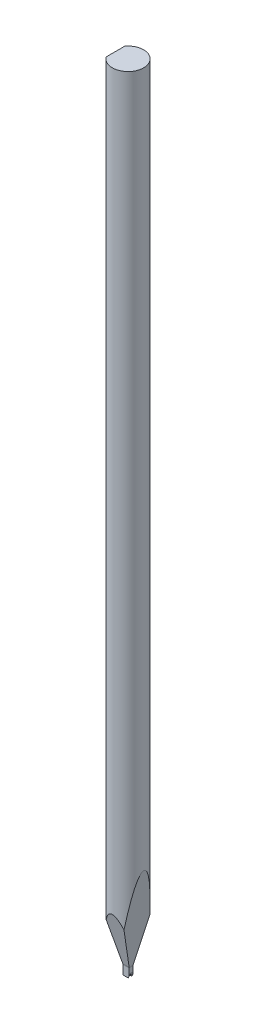
ISO-10303-21;
HEADER;
FILE_DESCRIPTION(('STEP AP214'),'2;1');
FILE_NAME('part.step','',(''),(''),'','','');
FILE_SCHEMA(('AUTOMOTIVE_DESIGN { 1 0 10303 214 1 1 1 1 }'));
ENDSEC;
DATA;
#1=APPLICATION_CONTEXT('core data for automotive mechanical design processes');
#2=APPLICATION_PROTOCOL_DEFINITION('international standard','automotive_design',2000,#1);
#3=PRODUCT_CONTEXT('',#1,'mechanical');
#4=PRODUCT('Part','Part','',(#3));
#5=PRODUCT_RELATED_PRODUCT_CATEGORY('part','',(#4));
#6=PRODUCT_DEFINITION_FORMATION('','',#4);
#7=PRODUCT_DEFINITION_CONTEXT('part definition',#1,'design');
#8=PRODUCT_DEFINITION('design','',#6,#7);
#9=PRODUCT_DEFINITION_SHAPE('','',#8);
#10=(LENGTH_UNIT() NAMED_UNIT(*) SI_UNIT(.MILLI.,.METRE.));
#11=(NAMED_UNIT(*) PLANE_ANGLE_UNIT() SI_UNIT($,.RADIAN.));
#12=(NAMED_UNIT(*) SI_UNIT($,.STERADIAN.) SOLID_ANGLE_UNIT());
#13=UNCERTAINTY_MEASURE_WITH_UNIT(LENGTH_MEASURE(1.E-05),#10,'distance_accuracy_value','');
#14=(GEOMETRIC_REPRESENTATION_CONTEXT(3) GLOBAL_UNCERTAINTY_ASSIGNED_CONTEXT((#13)) GLOBAL_UNIT_ASSIGNED_CONTEXT((#10,
#11,#12)) REPRESENTATION_CONTEXT('',''));
#15=CARTESIAN_POINT('',(0.,0.,0.));
#16=DIRECTION('',(0.,0.,1.));
#17=DIRECTION('',(1.,0.,0.));
#18=AXIS2_PLACEMENT_3D('',#15,#16,#17);
#19=CARTESIAN_POINT('',(0.,0.,0.));
#20=DIRECTION('',(0.,1.,0.));
#21=DIRECTION('',(0.,0.,1.));
#22=AXIS2_PLACEMENT_3D('',#19,#20,#21);
#23=PLANE('',#22);
#24=DIRECTION('',(-1.,0.,0.));
#25=VECTOR('',#24,1.);
#26=CARTESIAN_POINT('',(1.50859998,0.,-0.18161));
#27=LINE('',#26,#25);
#28=CARTESIAN_POINT('',(0.208640592430683,0.,-0.18161));
#29=VERTEX_POINT('',#28);
#30=CARTESIAN_POINT('',(-0.30226,0.,-0.18161));
#31=VERTEX_POINT('',#30);
#32=EDGE_CURVE('E335',#29,#31,#27,.T.);
#33=ORIENTED_EDGE('',*,*,#32,.F.);
#34=CARTESIAN_POINT('',(0.04826,0.,-0.414004033129109));
#35=DIRECTION('',(0.,1.,0.));
#36=DIRECTION('',(0.,0.,-1.));
#37=AXIS2_PLACEMENT_3D('',#34,#35,#36);
#38=ELLIPSE('',#37,0.303875210634501,0.24892);
#39=CARTESIAN_POINT('',(0.0482615048289154,0.,-0.110128822494608));
#40=VERTEX_POINT('',#39);
#41=EDGE_CURVE('E337',#29,#40,#38,.F.);
#42=ORIENTED_EDGE('',*,*,#41,.T.);
#43=CARTESIAN_POINT('',(0.0482615048289155,0.,-0.110128822494608));
#44=DIRECTION('',(-1.,0.,0.));
#45=VECTOR('',#44,1.);
#46=LINE('',#43,#45);
#47=CARTESIAN_POINT('',(-0.25146,0.,-0.110128822494608));
#48=VERTEX_POINT('',#47);
#49=EDGE_CURVE('E387',#40,#48,#46,.T.);
#50=ORIENTED_EDGE('',*,*,#49,.T.);
#51=CARTESIAN_POINT('',(-0.25146,0.,-0.17214417160369));
#52=DIRECTION('',(0.,1.,0.));
#53=DIRECTION('',(0.,0.,1.));
#54=AXIS2_PLACEMENT_3D('',#51,#52,#53);
#55=ELLIPSE('',#54,0.0620153491090818,0.0508);
#56=CARTESIAN_POINT('',(-0.30226,0.,-0.17214417160369));
#57=VERTEX_POINT('',#56);
#58=EDGE_CURVE('E476',#48,#57,#55,.F.);
#59=ORIENTED_EDGE('',*,*,#58,.T.);
#60=DIRECTION('',(0.,0.,-1.));
#61=VECTOR('',#60,1.);
#62=CARTESIAN_POINT('',(-0.30226,0.,0.18161));
#63=LINE('',#62,#61);
#64=EDGE_CURVE('E207',#57,#31,#63,.T.);
#65=ORIENTED_EDGE('',*,*,#64,.T.);
#66=EDGE_LOOP('',(#33,#42,#50,#59,#65));
#67=FACE_BOUND('',#66,.T.);
#68=ADVANCED_FACE('F41',(#67),#23,.F.);
#69=CARTESIAN_POINT('',(0.,75.9968,0.));
#70=DIRECTION('',(0.,-1.,0.));
#71=DIRECTION('',(0.,0.,-1.));
#72=AXIS2_PLACEMENT_3D('',#69,#70,#71);
#73=CYLINDRICAL_SURFACE('',#72,1.4986);
#74=CARTESIAN_POINT('',(0.,-1.25153165228785,0.));
#75=DIRECTION('',(-0.99026806874157,-0.139173100960066,0.));
#76=DIRECTION('',(0.139173100960066,-0.99026806874157,0.));
#77=AXIS2_PLACEMENT_3D('',#74,#75,#76);
#78=ELLIPSE('',#77,10.7678853863435,1.4986);
#79=CARTESIAN_POINT('',(-0.853200931790867,4.81930842488687,1.23201060465858));
#80=VERTEX_POINT('',#79);
#81=CARTESIAN_POINT('',(-1.20142,7.29701583957897,0.89576333012688));
#82=VERTEX_POINT('',#81);
#83=EDGE_CURVE('E428',#80,#82,#78,.T.);
#84=ORIENTED_EDGE('',*,*,#83,.F.);
#85=CARTESIAN_POINT('',(0.,0.221382252837424,0.));
#86=DIRECTION('',(0.,-0.258819045102522,0.965925826289068));
#87=DIRECTION('',(0.,-0.965925826289068,-0.258819045102522));
#88=AXIS2_PLACEMENT_3D('',#85,#86,#87);
#89=ELLIPSE('',#88,5.79014577310717,1.4986);
#90=CARTESIAN_POINT('',(0.849471292927085,4.82891674363001,1.23458514590642));
#91=VERTEX_POINT('',#90);
#92=EDGE_CURVE('E451',#91,#80,#89,.T.);
#93=ORIENTED_EDGE('',*,*,#92,.F.);
#94=CARTESIAN_POINT('',(0.,-1.21538557409825,0.));
#95=DIRECTION('',(0.990268068741571,-0.139173100960058,0.));
#96=DIRECTION('',(-0.139173100960058,-0.990268068741571,0.));
#97=AXIS2_PLACEMENT_3D('',#94,#95,#96);
#98=ELLIPSE('',#97,10.7678853863441,1.4986);
#99=CARTESIAN_POINT('',(0.849471292927085,4.82891674363001,-1.23458514590642));
#100=VERTEX_POINT('',#99);
#101=EDGE_CURVE('E441',#100,#91,#98,.T.);
#102=ORIENTED_EDGE('',*,*,#101,.F.);
#103=CARTESIAN_POINT('',(0.,0.221382252837424,0.));
#104=DIRECTION('',(0.,-0.258819045102522,-0.965925826289068));
#105=DIRECTION('',(0.,-0.965925826289068,0.258819045102522));
#106=AXIS2_PLACEMENT_3D('',#103,#104,#105);
#107=ELLIPSE('',#106,5.79014577310717,1.4986);
#108=CARTESIAN_POINT('',(-0.853200931790867,4.81930842488687,-1.23201060465858));
#109=VERTEX_POINT('',#108);
#110=EDGE_CURVE('E227',#109,#100,#107,.T.);
#111=ORIENTED_EDGE('',*,*,#110,.F.);
#112=CARTESIAN_POINT('',(-1.20142,7.29701583957897,-0.89576333012688));
#113=VERTEX_POINT('',#112);
#114=EDGE_CURVE('E435',#113,#109,#78,.T.);
#115=ORIENTED_EDGE('',*,*,#114,.F.);
#116=DIRECTION('',(0.,-1.,0.));
#117=VECTOR('',#116,1.);
#118=CARTESIAN_POINT('',(-1.20142,75.9968,-0.89576333012688));
#119=LINE('',#118,#117);
#120=CARTESIAN_POINT('',(-1.20142,75.9968,-0.89576333012688));
#121=VERTEX_POINT('',#120);
#122=EDGE_CURVE('E440',#121,#113,#119,.T.);
#123=ORIENTED_EDGE('',*,*,#122,.F.);
#124=CARTESIAN_POINT('',(0.,75.9968,0.));
#125=DIRECTION('',(0.,1.,0.));
#126=DIRECTION('',(0.,0.,1.));
#127=AXIS2_PLACEMENT_3D('',#124,#125,#126);
#128=CIRCLE('',#127,1.4986);
#129=CARTESIAN_POINT('',(-1.20142,75.9968,0.89576333012688));
#130=VERTEX_POINT('',#129);
#131=EDGE_CURVE('E442',#130,#121,#128,.T.);
#132=ORIENTED_EDGE('',*,*,#131,.F.);
#133=DIRECTION('',(0.,-1.,0.));
#134=VECTOR('',#133,1.);
#135=CARTESIAN_POINT('',(-1.20142,75.9968,0.89576333012688));
#136=LINE('',#135,#134);
#137=EDGE_CURVE('E437',#82,#130,#136,.F.);
#138=ORIENTED_EDGE('',*,*,#137,.F.);
#139=EDGE_LOOP('',(#84,#93,#102,#111,#115,#123,#132,#138));
#140=FACE_BOUND('',#139,.T.);
#141=ADVANCED_FACE('F251',(#140),#73,.T.);
#142=CARTESIAN_POINT('',(-1.20142,75.9968,1.50859998));
#143=DIRECTION('',(-1.,0.,0.));
#144=DIRECTION('',(0.,0.,1.));
#145=AXIS2_PLACEMENT_3D('',#142,#143,#144);
#146=PLANE('',#145);
#147=ORIENTED_EDGE('',*,*,#122,.T.);
#148=DIRECTION('',(0.,0.,1.));
#149=VECTOR('',#148,1.);
#150=CARTESIAN_POINT('',(-1.20142,7.29701583957897,1.50859998));
#151=LINE('',#150,#149);
#152=EDGE_CURVE('E430',#113,#82,#151,.T.);
#153=ORIENTED_EDGE('',*,*,#152,.T.);
#154=ORIENTED_EDGE('',*,*,#137,.T.);
#155=DIRECTION('',(0.,0.,-1.));
#156=VECTOR('',#155,1.);
#157=CARTESIAN_POINT('',(-1.20142,75.9968,1.50859998));
#158=LINE('',#157,#156);
#159=EDGE_CURVE('E434',#130,#121,#158,.T.);
#160=ORIENTED_EDGE('',*,*,#159,.T.);
#161=EDGE_LOOP('',(#147,#153,#154,#160));
#162=FACE_BOUND('',#161,.T.);
#163=ADVANCED_FACE('F255',(#162),#146,.T.);
#164=CARTESIAN_POINT('',(0.,75.9968,0.));
#165=DIRECTION('',(0.,1.,0.));
#166=DIRECTION('',(0.,0.,1.));
#167=AXIS2_PLACEMENT_3D('',#164,#165,#166);
#168=PLANE('',#167);
#169=ORIENTED_EDGE('',*,*,#131,.T.);
#170=ORIENTED_EDGE('',*,*,#159,.F.);
#171=EDGE_LOOP('',(#169,#170));
#172=FACE_BOUND('',#171,.T.);
#173=ADVANCED_FACE('F249',(#172),#168,.T.);
#174=CARTESIAN_POINT('',(1.50859998,0.931460303068842,-0.190264840122577));
#175=DIRECTION('',(0.,-0.258819045102522,-0.965925826289068));
#176=DIRECTION('',(0.,0.965925826289068,-0.258819045102522));
#177=AXIS2_PLACEMENT_3D('',#174,#175,#176);
#178=PLANE('',#177);
#179=ORIENTED_EDGE('',*,*,#110,.T.);
#180=DIRECTION('',(-0.13451818867903,-0.957146646836786,0.256466671058075));
#181=VECTOR('',#180,1.);
#182=CARTESIAN_POINT('',(0.323558186318037,1.08685054825878,-0.231901530832895));
#183=LINE('',#182,#181);
#184=CARTESIAN_POINT('',(0.301719511554435,0.931460303068842,-0.190264840122577));
#185=VERTEX_POINT('',#184);
#186=EDGE_CURVE('E497',#100,#185,#183,.T.);
#187=ORIENTED_EDGE('',*,*,#186,.T.);
#188=DIRECTION('',(-1.,0.,0.));
#189=VECTOR('',#188,1.);
#190=CARTESIAN_POINT('',(1.50859998,0.931460303068842,-0.190264840122577));
#191=LINE('',#190,#189);
#192=CARTESIAN_POINT('',(-0.306799511554435,0.931460303068842,-0.190264840122577));
#193=VERTEX_POINT('',#192);
#194=EDGE_CURVE('E202',#185,#193,#191,.T.);
#195=ORIENTED_EDGE('',*,*,#194,.T.);
#196=DIRECTION('',(-0.134518188679037,0.957146646836785,-0.256466671058074));
#197=VECTOR('',#196,1.);
#198=CARTESIAN_POINT('',(-0.273949597997433,0.697721022762415,-0.127634588725038));
#199=LINE('',#198,#197);
#200=EDGE_CURVE('E213',#193,#109,#199,.T.);
#201=ORIENTED_EDGE('',*,*,#200,.T.);
#202=EDGE_LOOP('',(#179,#187,#195,#201));
#203=FACE_BOUND('',#202,.T.);
#204=ADVANCED_FACE('F311',(#203),#178,.T.);
#205=CARTESIAN_POINT('',(1.50859998,0.931460303068842,0.190264840122577));
#206=DIRECTION('',(0.,-0.258819045102522,0.965925826289068));
#207=DIRECTION('',(0.,-0.965925826289068,-0.258819045102522));
#208=AXIS2_PLACEMENT_3D('',#205,#206,#207);
#209=PLANE('',#208);
#210=ORIENTED_EDGE('',*,*,#92,.T.);
#211=DIRECTION('',(0.134518188679037,-0.957146646836785,-0.256466671058074));
#212=VECTOR('',#211,1.);
#213=CARTESIAN_POINT('',(-0.273949597997433,0.697721022762415,0.127634588725038));
#214=LINE('',#213,#212);
#215=CARTESIAN_POINT('',(-0.306799511554435,0.931460303068842,0.190264840122577));
#216=VERTEX_POINT('',#215);
#217=EDGE_CURVE('E201',#80,#216,#214,.T.);
#218=ORIENTED_EDGE('',*,*,#217,.T.);
#219=DIRECTION('',(-1.,0.,0.));
#220=VECTOR('',#219,1.);
#221=CARTESIAN_POINT('',(1.50859998,0.931460303068842,0.190264840122577));
#222=LINE('',#221,#220);
#223=CARTESIAN_POINT('',(0.301719511554435,0.931460303068842,0.190264840122577));
#224=VERTEX_POINT('',#223);
#225=EDGE_CURVE('E188',#224,#216,#222,.T.);
#226=ORIENTED_EDGE('',*,*,#225,.F.);
#227=DIRECTION('',(0.13451818867903,0.957146646836786,0.256466671058075));
#228=VECTOR('',#227,1.);
#229=CARTESIAN_POINT('',(0.323558186318037,1.08685054825878,0.231901530832895));
#230=LINE('',#229,#228);
#231=EDGE_CURVE('E487',#224,#91,#230,.T.);
#232=ORIENTED_EDGE('',*,*,#231,.T.);
#233=EDGE_LOOP('',(#210,#218,#226,#232));
#234=FACE_BOUND('',#233,.T.);
#235=ADVANCED_FACE('F308',(#234),#209,.T.);
#236=CARTESIAN_POINT('',(0.29718,0.89916,1.50859998));
#237=DIRECTION('',(0.990268068741571,-0.139173100960058,0.));
#238=DIRECTION('',(0.139173100960058,0.990268068741571,0.));
#239=AXIS2_PLACEMENT_3D('',#236,#237,#238);
#240=PLANE('',#239);
#241=ORIENTED_EDGE('',*,*,#101,.T.);
#242=ORIENTED_EDGE('',*,*,#231,.F.);
#243=CARTESIAN_POINT('',(0.292480351816997,0.865720265612802,0.43561));
#244=DIRECTION('',(0.990268068741571,-0.139173100960058,0.));
#245=DIRECTION('',(-0.139173100960058,-0.990268068741571,0.));
#246=AXIS2_PLACEMENT_3D('',#243,#244,#245);
#247=ELLIPSE('',#246,0.256496203419729,0.254);
#248=CARTESIAN_POINT('',(0.29718,0.89916,0.183820833902422));
#249=VERTEX_POINT('',#248);
#250=EDGE_CURVE('E499',#249,#224,#247,.T.);
#251=ORIENTED_EDGE('',*,*,#250,.F.);
#252=DIRECTION('',(0.,0.,-1.));
#253=VECTOR('',#252,1.);
#254=CARTESIAN_POINT('',(0.29718,0.89916,1.50859998));
#255=LINE('',#254,#253);
#256=CARTESIAN_POINT('',(0.29718,0.89916,-0.183820833902422));
#257=VERTEX_POINT('',#256);
#258=EDGE_CURVE('E401',#249,#257,#255,.T.);
#259=ORIENTED_EDGE('',*,*,#258,.T.);
#260=CARTESIAN_POINT('',(0.292480351816997,0.865720265612802,-0.43561));
#261=DIRECTION('',(0.990268068741571,-0.139173100960058,0.));
#262=DIRECTION('',(-0.139173100960058,-0.990268068741571,0.));
#263=AXIS2_PLACEMENT_3D('',#260,#261,#262);
#264=ELLIPSE('',#263,0.256496203419729,0.254);
#265=EDGE_CURVE('E503',#185,#257,#264,.T.);
#266=ORIENTED_EDGE('',*,*,#265,.F.);
#267=ORIENTED_EDGE('',*,*,#186,.F.);
#268=EDGE_LOOP('',(#241,#242,#251,#259,#266,#267));
#269=FACE_BOUND('',#268,.T.);
#270=ADVANCED_FACE('F310',(#269),#240,.T.);
#271=CARTESIAN_POINT('',(-0.30226,0.89916,1.50859998));
#272=DIRECTION('',(-0.99026806874157,-0.139173100960066,0.));
#273=DIRECTION('',(0.139173100960066,-0.99026806874157,0.));
#274=AXIS2_PLACEMENT_3D('',#271,#272,#273);
#275=PLANE('',#274);
#276=ORIENTED_EDGE('',*,*,#83,.T.);
#277=ORIENTED_EDGE('',*,*,#152,.F.);
#278=ORIENTED_EDGE('',*,*,#114,.T.);
#279=ORIENTED_EDGE('',*,*,#200,.F.);
#280=CARTESIAN_POINT('',(-0.297560351816997,0.865720265612802,-0.43561));
#281=DIRECTION('',(-0.99026806874157,-0.139173100960066,0.));
#282=DIRECTION('',(-0.139173100960066,0.99026806874157,0.));
#283=AXIS2_PLACEMENT_3D('',#280,#281,#282);
#284=ELLIPSE('',#283,0.256496203419729,0.254);
#285=CARTESIAN_POINT('',(-0.30226,0.89916,-0.183820833902422));
#286=VERTEX_POINT('',#285);
#287=EDGE_CURVE('E208',#286,#193,#284,.T.);
#288=ORIENTED_EDGE('',*,*,#287,.F.);
#289=DIRECTION('',(0.,0.,-1.));
#290=VECTOR('',#289,1.);
#291=CARTESIAN_POINT('',(-0.30226,0.89916,1.50859998));
#292=LINE('',#291,#290);
#293=CARTESIAN_POINT('',(-0.30226,0.89916,0.183820833902422));
#294=VERTEX_POINT('',#293);
#295=EDGE_CURVE('E511',#294,#286,#292,.T.);
#296=ORIENTED_EDGE('',*,*,#295,.F.);
#297=CARTESIAN_POINT('',(-0.297560351816997,0.865720265612802,0.43561));
#298=DIRECTION('',(-0.99026806874157,-0.139173100960066,0.));
#299=DIRECTION('',(-0.139173100960066,0.99026806874157,0.));
#300=AXIS2_PLACEMENT_3D('',#297,#298,#299);
#301=ELLIPSE('',#300,0.256496203419729,0.254);
#302=EDGE_CURVE('E197',#216,#294,#301,.T.);
#303=ORIENTED_EDGE('',*,*,#302,.F.);
#304=ORIENTED_EDGE('',*,*,#217,.F.);
#305=EDGE_LOOP('',(#276,#277,#278,#279,#288,#296,#303,#304));
#306=FACE_BOUND('',#305,.T.);
#307=ADVANCED_FACE('F319',(#306),#275,.T.);
#308=CARTESIAN_POINT('',(1.50859998,0.865720265612802,-0.43561));
#309=DIRECTION('',(-1.,0.,0.));
#310=DIRECTION('',(0.,0.,1.));
#311=AXIS2_PLACEMENT_3D('',#308,#309,#310);
#312=CYLINDRICAL_SURFACE('',#311,0.254);
#313=ORIENTED_EDGE('',*,*,#265,.T.);
#314=CARTESIAN_POINT('',(0.29718,0.865720265612802,-0.43561));
#315=DIRECTION('',(1.,0.,0.));
#316=DIRECTION('',(0.,1.,0.));
#317=AXIS2_PLACEMENT_3D('',#314,#315,#316);
#318=CIRCLE('',#317,0.254);
#319=CARTESIAN_POINT('',(0.29718,0.865720265612802,-0.18161));
#320=VERTEX_POINT('',#319);
#321=EDGE_CURVE('E501',#257,#320,#318,.T.);
#322=ORIENTED_EDGE('',*,*,#321,.T.);
#323=DIRECTION('',(-1.,0.,0.));
#324=VECTOR('',#323,1.);
#325=CARTESIAN_POINT('',(1.50859998,0.865720265612802,-0.18161));
#326=LINE('',#325,#324);
#327=CARTESIAN_POINT('',(-0.30226,0.865720265612802,-0.18161));
#328=VERTEX_POINT('',#327);
#329=EDGE_CURVE('E342',#320,#328,#326,.T.);
#330=ORIENTED_EDGE('',*,*,#329,.T.);
#331=CARTESIAN_POINT('',(-0.30226,0.865720265612802,-0.43561));
#332=DIRECTION('',(-1.,0.,0.));
#333=DIRECTION('',(0.,-1.,0.));
#334=AXIS2_PLACEMENT_3D('',#331,#332,#333);
#335=CIRCLE('',#334,0.254);
#336=EDGE_CURVE('E189',#328,#286,#335,.T.);
#337=ORIENTED_EDGE('',*,*,#336,.T.);
#338=ORIENTED_EDGE('',*,*,#287,.T.);
#339=ORIENTED_EDGE('',*,*,#194,.F.);
#340=EDGE_LOOP('',(#313,#322,#330,#337,#338,#339));
#341=FACE_BOUND('',#340,.T.);
#342=ADVANCED_FACE('F307',(#341),#312,.F.);
#343=CARTESIAN_POINT('',(1.50859998,0.865720265612802,0.43561));
#344=DIRECTION('',(-1.,0.,0.));
#345=DIRECTION('',(0.,0.,1.));
#346=AXIS2_PLACEMENT_3D('',#343,#344,#345);
#347=CYLINDRICAL_SURFACE('',#346,0.254);
#348=ORIENTED_EDGE('',*,*,#250,.T.);
#349=ORIENTED_EDGE('',*,*,#225,.T.);
#350=ORIENTED_EDGE('',*,*,#302,.T.);
#351=CARTESIAN_POINT('',(-0.30226,0.865720265612802,0.43561));
#352=DIRECTION('',(-1.,0.,0.));
#353=DIRECTION('',(0.,-1.,0.));
#354=AXIS2_PLACEMENT_3D('',#351,#352,#353);
#355=CIRCLE('',#354,0.254);
#356=CARTESIAN_POINT('',(-0.30226,0.865720265612802,0.18161));
#357=VERTEX_POINT('',#356);
#358=EDGE_CURVE('E192',#294,#357,#355,.T.);
#359=ORIENTED_EDGE('',*,*,#358,.T.);
#360=DIRECTION('',(-1.,0.,0.));
#361=VECTOR('',#360,1.);
#362=CARTESIAN_POINT('',(1.50859998,0.865720265612802,0.18161));
#363=LINE('',#362,#361);
#364=CARTESIAN_POINT('',(0.29718,0.865720265612802,0.18161));
#365=VERTEX_POINT('',#364);
#366=EDGE_CURVE('E178',#365,#357,#363,.T.);
#367=ORIENTED_EDGE('',*,*,#366,.F.);
#368=CARTESIAN_POINT('',(0.29718,0.865720265612802,0.43561));
#369=DIRECTION('',(1.,0.,0.));
#370=DIRECTION('',(0.,1.,0.));
#371=AXIS2_PLACEMENT_3D('',#368,#369,#370);
#372=CIRCLE('',#371,0.254);
#373=EDGE_CURVE('E486',#365,#249,#372,.T.);
#374=ORIENTED_EDGE('',*,*,#373,.T.);
#375=EDGE_LOOP('',(#348,#349,#350,#359,#367,#374));
#376=FACE_BOUND('',#375,.T.);
#377=ADVANCED_FACE('F194',(#376),#347,.F.);
#378=CARTESIAN_POINT('',(1.50859998,-0.00999998000000009,-0.18161));
#379=DIRECTION('',(0.,0.,-1.));
#380=DIRECTION('',(-1.,0.,0.));
#381=AXIS2_PLACEMENT_3D('',#378,#379,#380);
#382=PLANE('',#381);
#383=CARTESIAN_POINT('',(0.29718,0.316465617625382,-0.18161));
#384=CARTESIAN_POINT('',(0.297191255462106,0.30476151015731,-0.18161));
#385=CARTESIAN_POINT('',(0.296704732202361,0.293076426948569,-0.18161));
#386=CARTESIAN_POINT('',(0.295016137746925,0.269795696895169,-0.18161));
#387=CARTESIAN_POINT('',(0.293816536547027,0.258199880631553,-0.18161));
#388=CARTESIAN_POINT('',(0.290983721822353,0.235114465077565,-0.18161));
#389=CARTESIAN_POINT('',(0.289352258003581,0.223624626572755,-0.18161));
#390=CARTESIAN_POINT('',(0.286011036491666,0.200645354015255,-0.18161));
#391=CARTESIAN_POINT('',(0.284301203781425,0.189155931349842,-0.18161));
#392=CARTESIAN_POINT('',(0.281210289358831,0.165999027470461,-0.18161));
#393=CARTESIAN_POINT('',(0.279833051519242,0.154330982093809,-0.18161));
#394=CARTESIAN_POINT('',(0.277864042115687,0.130934722353629,-0.18161));
#395=CARTESIAN_POINT('',(0.277271337662466,0.119206596129458,-0.18161));
#396=CARTESIAN_POINT('',(0.277088117477136,0.0957276961907913,-0.18161));
#397=CARTESIAN_POINT('',(0.277498739853765,0.0839769118793097,-0.18161));
#398=CARTESIAN_POINT('',(0.278752195115377,0.0663766938752387,-0.18161));
#399=CARTESIAN_POINT('',(0.279278172064318,0.0605011060360119,-0.18161));
#400=CARTESIAN_POINT('',(0.280492707934663,0.048769624740261,-0.18161));
#401=CARTESIAN_POINT('',(0.28118118176717,0.042913722597808,-0.18161));
#402=CARTESIAN_POINT('',(0.281925609781735,0.0370656176253821,-0.18161));
#403=B_SPLINE_CURVE_WITH_KNOTS('',3,(#383,#384,#385,#386,#387,#388,#389,#390,#391,#392,#393,
#394,#395,#396,#397,#398,#399,#400,#401,#402),.UNSPECIFIED.,.F.,.F.,(4,2,2,2,2,2,2,2,2,4),(0.,
0.0350745198218382,0.0700282489505561,0.104842473655311,0.139690749526502,0.174924326958595,
0.210115970366231,0.245347551414752,0.263043057782701,0.280729318658442),.UNSPECIFIED.);
#404=CARTESIAN_POINT('',(0.29718,0.316465617625382,-0.18161));
#405=VERTEX_POINT('',#404);
#406=CARTESIAN_POINT('',(0.290401361043401,0.231304691014265,-0.18161));
#407=VERTEX_POINT('',#406);
#408=EDGE_CURVE('E279',#405,#407,#403,.T.);
#409=ORIENTED_EDGE('',*,*,#408,.T.);
#410=CARTESIAN_POINT('',(0.0482600000000001,0.3318930751921,-0.18161));
#411=DIRECTION('',(0.,0.,-1.));
#412=DIRECTION('',(0.,-1.,0.));
#413=AXIS2_PLACEMENT_3D('',#410,#411,#412);
#414=ELLIPSE('',#413,0.433978776366005,0.24892);
#415=EDGE_CURVE('E347',#407,#29,#414,.T.);
#416=ORIENTED_EDGE('',*,*,#415,.T.);
#417=ORIENTED_EDGE('',*,*,#32,.T.);
#418=DIRECTION('',(0.,1.,0.));
#419=VECTOR('',#418,1.);
#420=CARTESIAN_POINT('',(-0.30226,-0.00999998000000031,-0.18161));
#421=LINE('',#420,#419);
#422=EDGE_CURVE('E219',#31,#328,#421,.T.);
#423=ORIENTED_EDGE('',*,*,#422,.T.);
#424=ORIENTED_EDGE('',*,*,#329,.F.);
#425=DIRECTION('',(0.,-1.,0.));
#426=VECTOR('',#425,1.);
#427=CARTESIAN_POINT('',(0.29718,-0.00999998000000002,-0.18161));
#428=LINE('',#427,#426);
#429=EDGE_CURVE('E483',#320,#405,#428,.T.);
#430=ORIENTED_EDGE('',*,*,#429,.T.);
#431=EDGE_LOOP('',(#409,#416,#417,#423,#424,#430));
#432=FACE_BOUND('',#431,.T.);
#433=ADVANCED_FACE('F303',(#432),#382,.T.);
#434=CARTESIAN_POINT('',(1.50859998,-0.00999998000000009,0.18161));
#435=DIRECTION('',(0.,0.,1.));
#436=DIRECTION('',(1.,0.,0.));
#437=AXIS2_PLACEMENT_3D('',#434,#435,#436);
#438=PLANE('',#437);
#439=DIRECTION('',(-1.,0.,0.));
#440=VECTOR('',#439,1.);
#441=CARTESIAN_POINT('',(1.50859998,0.,0.18161));
#442=LINE('',#441,#440);
#443=CARTESIAN_POINT('',(0.208640592430683,0.,0.18161));
#444=VERTEX_POINT('',#443);
#445=CARTESIAN_POINT('',(-0.30226,0.,0.18161));
#446=VERTEX_POINT('',#445);
#447=EDGE_CURVE('E343',#444,#446,#442,.T.);
#448=ORIENTED_EDGE('',*,*,#447,.F.);
#449=CARTESIAN_POINT('',(0.0482600000000001,0.3318930751921,0.18161));
#450=DIRECTION('',(0.,0.,1.));
#451=DIRECTION('',(0.,1.,0.));
#452=AXIS2_PLACEMENT_3D('',#449,#450,#451);
#453=ELLIPSE('',#452,0.433978776366005,0.24892);
#454=CARTESIAN_POINT('',(0.290401361043401,0.231304691014265,0.18161));
#455=VERTEX_POINT('',#454);
#456=EDGE_CURVE('E58',#444,#455,#453,.T.);
#457=ORIENTED_EDGE('',*,*,#456,.T.);
#458=CARTESIAN_POINT('',(0.29718,0.316465617625382,0.18161));
#459=CARTESIAN_POINT('',(0.297191255462106,0.30476151015731,0.18161));
#460=CARTESIAN_POINT('',(0.296704732202361,0.293076426948569,0.18161));
#461=CARTESIAN_POINT('',(0.295016137746925,0.269795696895169,0.18161));
#462=CARTESIAN_POINT('',(0.293816536547027,0.258199880631553,0.18161));
#463=CARTESIAN_POINT('',(0.290983721822353,0.235114465077565,0.18161));
#464=CARTESIAN_POINT('',(0.289352258003581,0.223624626572755,0.18161));
#465=CARTESIAN_POINT('',(0.286011036491666,0.200645354015255,0.18161));
#466=CARTESIAN_POINT('',(0.284301203781425,0.189155931349842,0.18161));
#467=CARTESIAN_POINT('',(0.281210289358831,0.165999027470461,0.18161));
#468=CARTESIAN_POINT('',(0.279833051519242,0.154330982093809,0.18161));
#469=CARTESIAN_POINT('',(0.277864042115687,0.130934722353629,0.18161));
#470=CARTESIAN_POINT('',(0.277271337662466,0.119206596129458,0.18161));
#471=CARTESIAN_POINT('',(0.277088117477136,0.0957276961907913,0.18161));
#472=CARTESIAN_POINT('',(0.277498739853765,0.0839769118793097,0.18161));
#473=CARTESIAN_POINT('',(0.278752195115377,0.0663766938752387,0.18161));
#474=CARTESIAN_POINT('',(0.279278172064318,0.0605011060360119,0.18161));
#475=CARTESIAN_POINT('',(0.280492707934663,0.048769624740261,0.18161));
#476=CARTESIAN_POINT('',(0.28118118176717,0.042913722597808,0.18161));
#477=CARTESIAN_POINT('',(0.281925609781735,0.0370656176253821,0.18161));
#478=B_SPLINE_CURVE_WITH_KNOTS('',3,(#458,#459,#460,#461,#462,#463,#464,#465,#466,#467,#468,
#469,#470,#471,#472,#473,#474,#475,#476,#477),.UNSPECIFIED.,.F.,.F.,(4,2,2,2,2,2,2,2,2,4),(0.,
0.0350745198218382,0.0700282489505561,0.104842473655311,0.139690749526502,0.174924326958595,
0.210115970366231,0.245347551414752,0.263043057782701,0.280729318658442),.UNSPECIFIED.);
#479=CARTESIAN_POINT('',(0.29718,0.316465617625382,0.18161));
#480=VERTEX_POINT('',#479);
#481=EDGE_CURVE('E63',#455,#480,#478,.F.);
#482=ORIENTED_EDGE('',*,*,#481,.T.);
#483=DIRECTION('',(0.,1.,0.));
#484=VECTOR('',#483,1.);
#485=CARTESIAN_POINT('',(0.29718,-0.00999998000000002,0.18161));
#486=LINE('',#485,#484);
#487=EDGE_CURVE('E184',#480,#365,#486,.T.);
#488=ORIENTED_EDGE('',*,*,#487,.T.);
#489=ORIENTED_EDGE('',*,*,#366,.T.);
#490=DIRECTION('',(0.,-1.,0.));
#491=VECTOR('',#490,1.);
#492=CARTESIAN_POINT('',(-0.30226,-0.00999998000000031,0.18161));
#493=LINE('',#492,#491);
#494=EDGE_CURVE('E182',#357,#446,#493,.T.);
#495=ORIENTED_EDGE('',*,*,#494,.T.);
#496=EDGE_LOOP('',(#448,#457,#482,#488,#489,#495));
#497=FACE_BOUND('',#496,.T.);
#498=ADVANCED_FACE('F180',(#497),#438,.T.);
#499=CARTESIAN_POINT('',(-0.30226,0.88916002,1.50859998));
#500=DIRECTION('',(-1.,0.,0.));
#501=DIRECTION('',(0.,-1.,0.));
#502=AXIS2_PLACEMENT_3D('',#499,#500,#501);
#503=PLANE('',#502);
#504=CARTESIAN_POINT('',(-0.30226,0.10414,0.));
#505=DIRECTION('',(-1.,0.,0.));
#506=DIRECTION('',(0.,-1.,0.));
#507=AXIS2_PLACEMENT_3D('',#504,#505,#506);
#508=CIRCLE('',#507,0.0812800000000002);
#509=CARTESIAN_POINT('',(-0.30226,0.150760292746613,-0.0665806781598095));
#510=VERTEX_POINT('',#509);
#511=CARTESIAN_POINT('',(-0.30226,0.150760292746613,0.0665806781598095));
#512=VERTEX_POINT('',#511);
#513=EDGE_CURVE('E460',#510,#512,#508,.F.);
#514=ORIENTED_EDGE('',*,*,#513,.T.);
#515=DIRECTION('',(0.,0.819152044288994,-0.573576436351044));
#516=VECTOR('',#515,1.);
#517=CARTESIAN_POINT('',(-0.30226,0.0291376829666329,0.151741746344489));
#518=LINE('',#517,#516);
#519=CARTESIAN_POINT('',(-0.30226,0.,0.17214417160369));
#520=VERTEX_POINT('',#519);
#521=EDGE_CURVE('E465',#512,#520,#518,.F.);
#522=ORIENTED_EDGE('',*,*,#521,.T.);
#523=EDGE_CURVE('E206',#446,#520,#63,.T.);
#524=ORIENTED_EDGE('',*,*,#523,.F.);
#525=ORIENTED_EDGE('',*,*,#494,.F.);
#526=ORIENTED_EDGE('',*,*,#358,.F.);
#527=ORIENTED_EDGE('',*,*,#295,.T.);
#528=ORIENTED_EDGE('',*,*,#336,.F.);
#529=ORIENTED_EDGE('',*,*,#422,.F.);
#530=ORIENTED_EDGE('',*,*,#64,.F.);
#531=DIRECTION('',(0.,-0.819152044288993,-0.573576436351044));
#532=VECTOR('',#531,1.);
#533=CARTESIAN_POINT('',(-0.30226,0.150760292746613,-0.0665806781598094));
#534=LINE('',#533,#532);
#535=EDGE_CURVE('E458',#57,#510,#534,.F.);
#536=ORIENTED_EDGE('',*,*,#535,.T.);
#537=EDGE_LOOP('',(#514,#522,#524,#525,#526,#527,#528,#529,#530,#536));
#538=FACE_BOUND('',#537,.T.);
#539=ADVANCED_FACE('F204',(#538),#503,.T.);
#540=CARTESIAN_POINT('',(0.29718,-0.00999998,1.50859998));
#541=DIRECTION('',(1.,0.,0.));
#542=DIRECTION('',(0.,1.,0.));
#543=AXIS2_PLACEMENT_3D('',#540,#541,#542);
#544=PLANE('',#543);
#545=ORIENTED_EDGE('',*,*,#487,.F.);
#546=CARTESIAN_POINT('',(0.29718,0.10414,0.));
#547=DIRECTION('',(1.,0.,0.));
#548=DIRECTION('',(0.,1.,0.));
#549=AXIS2_PLACEMENT_3D('',#546,#547,#548);
#550=CIRCLE('',#549,0.2794);
#551=EDGE_CURVE('E11',#480,#405,#550,.F.);
#552=ORIENTED_EDGE('',*,*,#551,.T.);
#553=ORIENTED_EDGE('',*,*,#429,.F.);
#554=ORIENTED_EDGE('',*,*,#321,.F.);
#555=ORIENTED_EDGE('',*,*,#258,.F.);
#556=ORIENTED_EDGE('',*,*,#373,.F.);
#557=EDGE_LOOP('',(#545,#552,#553,#554,#555,#556));
#558=FACE_BOUND('',#557,.T.);
#559=ADVANCED_FACE('F247',(#558),#544,.T.);
#560=CARTESIAN_POINT('',(-0.25146,0.,0.110128822494608));
#561=DIRECTION('',(1.,0.,0.));
#562=VECTOR('',#561,1.);
#563=LINE('',#560,#562);
#564=CARTESIAN_POINT('',(-0.25146,0.,0.110128822494608));
#565=VERTEX_POINT('',#564);
#566=CARTESIAN_POINT('',(0.0482599999999992,0.,0.110128822494608));
#567=VERTEX_POINT('',#566);
#568=EDGE_CURVE('E361',#565,#567,#563,.T.);
#569=ORIENTED_EDGE('',*,*,#568,.T.);
#570=CARTESIAN_POINT('',(0.0482600000000001,0.,0.414004033129109));
#571=DIRECTION('',(0.,1.,0.));
#572=DIRECTION('',(0.,0.,-1.));
#573=AXIS2_PLACEMENT_3D('',#570,#571,#572);
#574=ELLIPSE('',#573,0.303875210634501,0.24892);
#575=EDGE_CURVE('E295',#567,#444,#574,.F.);
#576=ORIENTED_EDGE('',*,*,#575,.T.);
#577=ORIENTED_EDGE('',*,*,#447,.T.);
#578=ORIENTED_EDGE('',*,*,#523,.T.);
#579=CARTESIAN_POINT('',(-0.25146,0.,0.17214417160369));
#580=DIRECTION('',(0.,1.,0.));
#581=DIRECTION('',(0.,0.,1.));
#582=AXIS2_PLACEMENT_3D('',#579,#580,#581);
#583=ELLIPSE('',#582,0.0620153491090818,0.0508);
#584=EDGE_CURVE('E464',#520,#565,#583,.F.);
#585=ORIENTED_EDGE('',*,*,#584,.T.);
#586=EDGE_LOOP('',(#569,#576,#577,#578,#585));
#587=FACE_BOUND('',#586,.T.);
#588=ADVANCED_FACE('F236',(#587),#23,.F.);
#589=CARTESIAN_POINT('',(-1.20142,0.12162260977998,-0.0249677543099286));
#590=DIRECTION('',(0.,0.573576436351044,-0.819152044288993));
#591=DIRECTION('',(0.,0.819152044288993,0.573576436351044));
#592=AXIS2_PLACEMENT_3D('',#589,#590,#591);
#593=PLANE('',#592);
#594=ORIENTED_EDGE('',*,*,#49,.F.);
#595=DIRECTION('',(0.,0.819152044288993,0.573576436351044));
#596=VECTOR('',#595,1.);
#597=CARTESIAN_POINT('',(0.0482600000000001,0.12162260977998,-0.0249677543099286));
#598=LINE('',#597,#596);
#599=CARTESIAN_POINT('',(0.0482600000000001,0.12162260977998,-0.0249677543099286));
#600=VERTEX_POINT('',#599);
#601=EDGE_CURVE('E350',#40,#600,#598,.T.);
#602=ORIENTED_EDGE('',*,*,#601,.T.);
#603=DIRECTION('',(1.,0.,0.));
#604=VECTOR('',#603,1.);
#605=CARTESIAN_POINT('',(-1.20142,0.12162260977998,-0.0249677543099286));
#606=LINE('',#605,#604);
#607=CARTESIAN_POINT('',(-0.25146,0.12162260977998,-0.0249677543099286));
#608=VERTEX_POINT('',#607);
#609=EDGE_CURVE('E380',#608,#600,#606,.T.);
#610=ORIENTED_EDGE('',*,*,#609,.F.);
#611=DIRECTION('',(0.,-0.819152044288993,-0.573576436351044));
#612=VECTOR('',#611,1.);
#613=CARTESIAN_POINT('',(-0.25146,0.,-0.110128822494608));
#614=LINE('',#613,#612);
#615=EDGE_CURVE('E468',#608,#48,#614,.T.);
#616=ORIENTED_EDGE('',*,*,#615,.T.);
#617=EDGE_LOOP('',(#594,#602,#610,#616));
#618=FACE_BOUND('',#617,.T.);
#619=ADVANCED_FACE('F246',(#618),#593,.F.);
#620=CARTESIAN_POINT('',(-1.20142,-0.00999998000000012,0.117130883872554));
#621=DIRECTION('',(0.,0.573576436351044,0.819152044288993));
#622=DIRECTION('',(0.,-0.819152044288994,0.573576436351044));
#623=AXIS2_PLACEMENT_3D('',#620,#621,#622);
#624=PLANE('',#623);
#625=DIRECTION('',(1.,0.,0.));
#626=VECTOR('',#625,1.);
#627=CARTESIAN_POINT('',(-1.20142,0.12162260977998,0.0249677543099286));
#628=LINE('',#627,#626);
#629=CARTESIAN_POINT('',(-0.25146,0.12162260977998,0.0249677543099286));
#630=VERTEX_POINT('',#629);
#631=CARTESIAN_POINT('',(0.0482600000000001,0.12162260977998,0.0249677543099286));
#632=VERTEX_POINT('',#631);
#633=EDGE_CURVE('E520',#630,#632,#628,.T.);
#634=ORIENTED_EDGE('',*,*,#633,.T.);
#635=DIRECTION('',(0.,-0.819152044288994,0.573576436351044));
#636=VECTOR('',#635,1.);
#637=CARTESIAN_POINT('',(0.0482600000000001,0.,0.110128822494608));
#638=LINE('',#637,#636);
#639=EDGE_CURVE('E351',#632,#567,#638,.T.);
#640=ORIENTED_EDGE('',*,*,#639,.T.);
#641=ORIENTED_EDGE('',*,*,#568,.F.);
#642=DIRECTION('',(0.,0.819152044288994,-0.573576436351044));
#643=VECTOR('',#642,1.);
#644=CARTESIAN_POINT('',(-0.25146,0.12162260977998,0.0249677543099287));
#645=LINE('',#644,#643);
#646=EDGE_CURVE('E456',#565,#630,#645,.T.);
#647=ORIENTED_EDGE('',*,*,#646,.T.);
#648=EDGE_LOOP('',(#634,#640,#641,#647));
#649=FACE_BOUND('',#648,.T.);
#650=ADVANCED_FACE('F411',(#649),#624,.F.);
#651=CARTESIAN_POINT('',(-1.20142,0.10414,0.));
#652=DIRECTION('',(1.,0.,0.));
#653=DIRECTION('',(0.,0.,-1.));
#654=AXIS2_PLACEMENT_3D('',#651,#652,#653);
#655=CYLINDRICAL_SURFACE('',#654,0.0304800000000002);
#656=ORIENTED_EDGE('',*,*,#609,.T.);
#657=CARTESIAN_POINT('',(0.0482600000000001,0.10414,0.));
#658=DIRECTION('',(1.,0.,0.));
#659=DIRECTION('',(0.,1.,0.));
#660=AXIS2_PLACEMENT_3D('',#657,#658,#659);
#661=CIRCLE('',#660,0.0304800000000002);
#662=EDGE_CURVE('E50',#600,#632,#661,.T.);
#663=ORIENTED_EDGE('',*,*,#662,.T.);
#664=ORIENTED_EDGE('',*,*,#633,.F.);
#665=CARTESIAN_POINT('',(-0.25146,0.10414,0.));
#666=DIRECTION('',(-1.,0.,0.));
#667=DIRECTION('',(0.,-1.,0.));
#668=AXIS2_PLACEMENT_3D('',#665,#666,#667);
#669=CIRCLE('',#668,0.0304800000000002);
#670=EDGE_CURVE('E466',#630,#608,#669,.T.);
#671=ORIENTED_EDGE('',*,*,#670,.T.);
#672=EDGE_LOOP('',(#656,#663,#664,#671));
#673=FACE_BOUND('',#672,.T.);
#674=ADVANCED_FACE('F268',(#673),#655,.F.);
#675=CARTESIAN_POINT('',(-0.25146,0.150760292746613,-0.0665806781598094));
#676=DIRECTION('',(0.,0.819152044288993,0.573576436351044));
#677=DIRECTION('',(0.,-0.573576436351044,0.819152044288993));
#678=AXIS2_PLACEMENT_3D('',#675,#676,#677);
#679=CYLINDRICAL_SURFACE('',#678,0.0508);
#680=ORIENTED_EDGE('',*,*,#58,.F.);
#681=ORIENTED_EDGE('',*,*,#615,.F.);
#682=CARTESIAN_POINT('',(-0.25146,0.150760292746613,-0.0665806781598095));
#683=DIRECTION('',(0.,0.819152044288993,0.573576436351044));
#684=DIRECTION('',(0.,-0.573576436351045,0.819152044288993));
#685=AXIS2_PLACEMENT_3D('',#682,#683,#684);
#686=CIRCLE('',#685,0.0508);
#687=EDGE_CURVE('E373',#510,#608,#686,.T.);
#688=ORIENTED_EDGE('',*,*,#687,.F.);
#689=ORIENTED_EDGE('',*,*,#535,.F.);
#690=EDGE_LOOP('',(#680,#681,#688,#689));
#691=FACE_BOUND('',#690,.T.);
#692=ADVANCED_FACE('F264',(#691),#679,.T.);
#693=CARTESIAN_POINT('',(-0.25146,0.10414,0.));
#694=DIRECTION('',(-1.,0.,0.));
#695=DIRECTION('',(0.,-1.,0.));
#696=AXIS2_PLACEMENT_3D('',#693,#694,#695);
#697=TOROIDAL_SURFACE('',#696,0.0812800000000002,0.0508);
#698=ORIENTED_EDGE('',*,*,#687,.T.);
#699=ORIENTED_EDGE('',*,*,#670,.F.);
#700=CARTESIAN_POINT('',(-0.25146,0.150760292746613,0.0665806781598095));
#701=DIRECTION('',(0.,-0.819152044288993,0.573576436351044));
#702=DIRECTION('',(0.,-0.573576436351044,-0.819152044288993));
#703=AXIS2_PLACEMENT_3D('',#700,#701,#702);
#704=CIRCLE('',#703,0.0508);
#705=EDGE_CURVE('E372',#512,#630,#704,.T.);
#706=ORIENTED_EDGE('',*,*,#705,.F.);
#707=ORIENTED_EDGE('',*,*,#513,.F.);
#708=EDGE_LOOP('',(#698,#699,#706,#707));
#709=FACE_BOUND('',#708,.T.);
#710=ADVANCED_FACE('F260',(#709),#697,.T.);
#711=CARTESIAN_POINT('',(-0.25146,0.019137702966633,0.158743807722435));
#712=DIRECTION('',(0.,-0.819152044288994,0.573576436351044));
#713=DIRECTION('',(0.,-0.573576436351044,-0.819152044288993));
#714=AXIS2_PLACEMENT_3D('',#711,#712,#713);
#715=CYLINDRICAL_SURFACE('',#714,0.0508);
#716=ORIENTED_EDGE('',*,*,#584,.F.);
#717=ORIENTED_EDGE('',*,*,#521,.F.);
#718=ORIENTED_EDGE('',*,*,#705,.T.);
#719=ORIENTED_EDGE('',*,*,#646,.F.);
#720=EDGE_LOOP('',(#716,#717,#718,#719));
#721=FACE_BOUND('',#720,.T.);
#722=ADVANCED_FACE('F257',(#721),#715,.T.);
#723=CARTESIAN_POINT('',(0.0482600000000001,0.132774666536502,0.321034210736971));
#724=DIRECTION('',(0.,0.819152044288994,-0.573576436351044));
#725=DIRECTION('',(0.,0.573576436351044,0.819152044288993));
#726=AXIS2_PLACEMENT_3D('',#723,#724,#725);
#727=CYLINDRICAL_SURFACE('',#726,0.24892);
#728=ORIENTED_EDGE('',*,*,#575,.F.);
#729=ORIENTED_EDGE('',*,*,#639,.F.);
#730=CARTESIAN_POINT('',(0.0482600000000001,0.264397256316482,0.228871081174345));
#731=DIRECTION('',(0.,0.819152044288993,-0.573576436351044));
#732=DIRECTION('',(0.,0.573576436351044,0.819152044288994));
#733=AXIS2_PLACEMENT_3D('',#730,#731,#732);
#734=CIRCLE('',#733,0.24892);
#735=EDGE_CURVE('E45',#455,#632,#734,.T.);
#736=ORIENTED_EDGE('',*,*,#735,.F.);
#737=ORIENTED_EDGE('',*,*,#456,.F.);
#738=EDGE_LOOP('',(#728,#729,#736,#737));
#739=FACE_BOUND('',#738,.T.);
#740=ADVANCED_FACE('F43',(#739),#727,.T.);
#741=CARTESIAN_POINT('',(0.0482600000000001,0.10414,0.));
#742=DIRECTION('',(1.,0.,0.));
#743=DIRECTION('',(0.,1.,0.));
#744=AXIS2_PLACEMENT_3D('',#741,#742,#743);
#745=TOROIDAL_SURFACE('',#744,0.2794,0.24892);
#746=ORIENTED_EDGE('',*,*,#735,.T.);
#747=ORIENTED_EDGE('',*,*,#662,.F.);
#748=CARTESIAN_POINT('',(0.0482600000000001,0.264397256316482,-0.228871081174345));
#749=DIRECTION('',(0.,-0.819152044288993,-0.573576436351045));
#750=DIRECTION('',(0.,0.573576436351045,-0.819152044288993));
#751=AXIS2_PLACEMENT_3D('',#748,#749,#750);
#752=CIRCLE('',#751,0.24892);
#753=EDGE_CURVE('E371',#407,#600,#752,.T.);
#754=ORIENTED_EDGE('',*,*,#753,.F.);
#755=ORIENTED_EDGE('',*,*,#408,.F.);
#756=ORIENTED_EDGE('',*,*,#551,.F.);
#757=ORIENTED_EDGE('',*,*,#481,.F.);
#758=EDGE_LOOP('',(#746,#747,#754,#755,#756,#757));
#759=FACE_BOUND('',#758,.T.);
#760=ADVANCED_FACE('F272',(#759),#745,.T.);
#761=CARTESIAN_POINT('',(0.0482600000000001,0.264397256316482,-0.228871081174345));
#762=DIRECTION('',(0.,-0.819152044288993,-0.573576436351044));
#763=DIRECTION('',(0.,0.573576436351044,-0.819152044288993));
#764=AXIS2_PLACEMENT_3D('',#761,#762,#763);
#765=CYLINDRICAL_SURFACE('',#764,0.24892);
#766=ORIENTED_EDGE('',*,*,#41,.F.);
#767=ORIENTED_EDGE('',*,*,#415,.F.);
#768=ORIENTED_EDGE('',*,*,#753,.T.);
#769=ORIENTED_EDGE('',*,*,#601,.F.);
#770=EDGE_LOOP('',(#766,#767,#768,#769));
#771=FACE_BOUND('',#770,.T.);
#772=ADVANCED_FACE('F270',(#771),#765,.T.);
#773=CLOSED_SHELL('',(#68,#141,#163,#173,#204,#235,#270,#307,#342,#377,#433,#498,#539,#559,#588,
#619,#650,#674,#692,#710,#722,#740,#760,#772));
#774=MANIFOLD_SOLID_BREP('B2',#773);
#775=ADVANCED_BREP_SHAPE_REPRESENTATION('',(#18,#774),#14);
#776=SHAPE_DEFINITION_REPRESENTATION(#9,#775);
ENDSEC;
END-ISO-10303-21;
